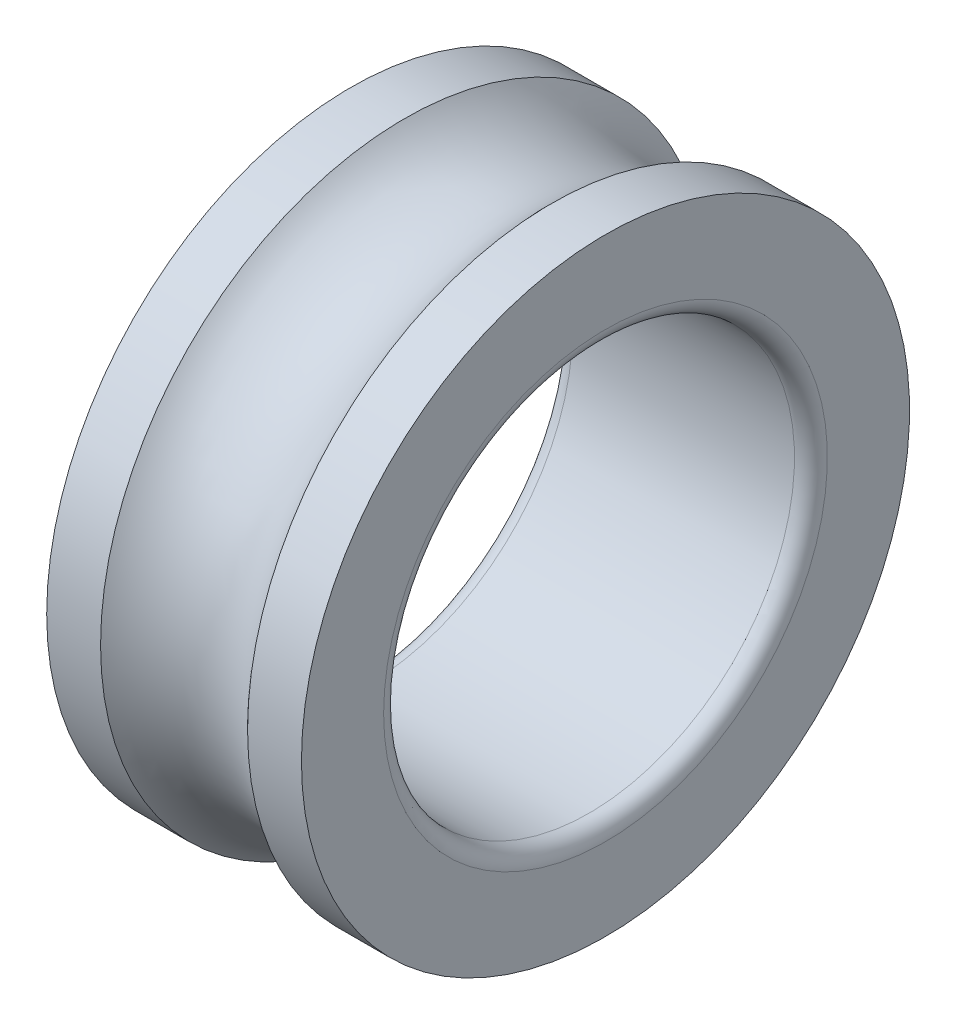
ISO-10303-21;
HEADER;
FILE_DESCRIPTION(('STEP AP214'),'2;1');
FILE_NAME('part.step','',(''),(''),'','','');
FILE_SCHEMA(('AUTOMOTIVE_DESIGN { 1 0 10303 214 1 1 1 1 }'));
ENDSEC;
DATA;
#1=APPLICATION_CONTEXT('core data for automotive mechanical design processes');
#2=APPLICATION_PROTOCOL_DEFINITION('international standard','automotive_design',2000,#1);
#3=PRODUCT_CONTEXT('',#1,'mechanical');
#4=PRODUCT('Part','Part','',(#3));
#5=PRODUCT_RELATED_PRODUCT_CATEGORY('part','',(#4));
#6=PRODUCT_DEFINITION_FORMATION('','',#4);
#7=PRODUCT_DEFINITION_CONTEXT('part definition',#1,'design');
#8=PRODUCT_DEFINITION('design','',#6,#7);
#9=PRODUCT_DEFINITION_SHAPE('','',#8);
#10=(LENGTH_UNIT() NAMED_UNIT(*) SI_UNIT(.MILLI.,.METRE.));
#11=(NAMED_UNIT(*) PLANE_ANGLE_UNIT() SI_UNIT($,.RADIAN.));
#12=(NAMED_UNIT(*) SI_UNIT($,.STERADIAN.) SOLID_ANGLE_UNIT());
#13=UNCERTAINTY_MEASURE_WITH_UNIT(LENGTH_MEASURE(1.E-05),#10,'distance_accuracy_value','');
#14=(GEOMETRIC_REPRESENTATION_CONTEXT(3) GLOBAL_UNCERTAINTY_ASSIGNED_CONTEXT((#13)) GLOBAL_UNIT_ASSIGNED_CONTEXT((#10,
#11,#12)) REPRESENTATION_CONTEXT('',''));
#15=CARTESIAN_POINT('',(0.,0.,0.));
#16=DIRECTION('',(0.,0.,1.));
#17=DIRECTION('',(1.,0.,0.));
#18=AXIS2_PLACEMENT_3D('',#15,#16,#17);
#19=CARTESIAN_POINT('',(2.62307692307692,6.26153846153845,0.));
#20=DIRECTION('',(-1.,0.,0.));
#21=DIRECTION('',(0.,0.,1.));
#22=AXIS2_PLACEMENT_3D('',#19,#20,#21);
#23=PLANE('',#22);
#24=CARTESIAN_POINT('',(2.62307692307692,0.,0.));
#25=DIRECTION('',(-1.,0.,0.));
#26=DIRECTION('',(0.,0.,1.));
#27=AXIS2_PLACEMENT_3D('',#24,#25,#26);
#28=CIRCLE('',#27,4.56923076923076);
#29=CARTESIAN_POINT('',(2.62307692307692,0.,4.56923076923076));
#30=VERTEX_POINT('',#29);
#31=EDGE_CURVE('E10',#30,#30,#28,.T.);
#32=ORIENTED_EDGE('',*,*,#31,.T.);
#33=EDGE_LOOP('',(#32));
#34=FACE_BOUND('',#33,.T.);
#35=CARTESIAN_POINT('',(2.62307692307692,0.,0.));
#36=DIRECTION('',(-1.,0.,0.));
#37=DIRECTION('',(0.,0.,1.));
#38=AXIS2_PLACEMENT_3D('',#35,#36,#37);
#39=CIRCLE('',#38,6.26153846153845);
#40=CARTESIAN_POINT('',(2.62307692307692,0.,6.26153846153845));
#41=VERTEX_POINT('',#40);
#42=EDGE_CURVE('E53',#41,#41,#39,.T.);
#43=ORIENTED_EDGE('',*,*,#42,.F.);
#44=EDGE_LOOP('',(#43));
#45=FACE_BOUND('',#44,.T.);
#46=ADVANCED_FACE('F33',(#34,#45),#23,.F.);
#47=CARTESIAN_POINT('',(0.,0.,0.));
#48=DIRECTION('',(-1.,0.,0.));
#49=DIRECTION('',(0.,0.,1.));
#50=AXIS2_PLACEMENT_3D('',#47,#48,#49);
#51=CYLINDRICAL_SURFACE('',#50,6.26153846153845);
#52=CARTESIAN_POINT('',(1.51364601553832,0.,0.));
#53=DIRECTION('',(-1.,0.,0.));
#54=DIRECTION('',(0.,0.,1.));
#55=AXIS2_PLACEMENT_3D('',#52,#53,#54);
#56=CIRCLE('',#55,6.26153846153845);
#57=CARTESIAN_POINT('',(1.51364601553832,0.,6.26153846153845));
#58=VERTEX_POINT('',#57);
#59=EDGE_CURVE('E56',#58,#58,#56,.T.);
#60=ORIENTED_EDGE('',*,*,#59,.F.);
#61=EDGE_LOOP('',(#60));
#62=FACE_BOUND('',#61,.T.);
#63=ORIENTED_EDGE('',*,*,#42,.T.);
#64=EDGE_LOOP('',(#63));
#65=FACE_BOUND('',#64,.T.);
#66=ADVANCED_FACE('F77',(#62,#65),#51,.T.);
#67=CARTESIAN_POINT('',(0.,0.,0.));
#68=DIRECTION('',(-1.,0.,0.));
#69=DIRECTION('',(0.,0.,1.));
#70=AXIS2_PLACEMENT_3D('',#67,#68,#69);
#71=TOROIDAL_SURFACE('',#70,7.6153846153846,2.03076923076923);
#72=CARTESIAN_POINT('',(-1.51364601553832,0.,0.));
#73=DIRECTION('',(-1.,0.,0.));
#74=DIRECTION('',(0.,0.,1.));
#75=AXIS2_PLACEMENT_3D('',#72,#73,#74);
#76=CIRCLE('',#75,6.26153846153845);
#77=CARTESIAN_POINT('',(-1.51364601553832,0.,6.26153846153845));
#78=VERTEX_POINT('',#77);
#79=EDGE_CURVE('E59',#78,#78,#76,.T.);
#80=ORIENTED_EDGE('',*,*,#79,.F.);
#81=EDGE_LOOP('',(#80));
#82=FACE_BOUND('',#81,.T.);
#83=ORIENTED_EDGE('',*,*,#59,.T.);
#84=EDGE_LOOP('',(#83));
#85=FACE_BOUND('',#84,.T.);
#86=ADVANCED_FACE('F71',(#82,#85),#71,.F.);
#87=CARTESIAN_POINT('',(0.,0.,0.));
#88=DIRECTION('',(-1.,0.,0.));
#89=DIRECTION('',(0.,0.,1.));
#90=AXIS2_PLACEMENT_3D('',#87,#88,#89);
#91=CYLINDRICAL_SURFACE('',#90,6.26153846153845);
#92=CARTESIAN_POINT('',(-2.62307692307692,0.,0.));
#93=DIRECTION('',(-1.,0.,0.));
#94=DIRECTION('',(0.,0.,1.));
#95=AXIS2_PLACEMENT_3D('',#92,#93,#94);
#96=CIRCLE('',#95,6.26153846153845);
#97=CARTESIAN_POINT('',(-2.62307692307692,0.,6.26153846153845));
#98=VERTEX_POINT('',#97);
#99=EDGE_CURVE('E62',#98,#98,#96,.T.);
#100=ORIENTED_EDGE('',*,*,#99,.F.);
#101=EDGE_LOOP('',(#100));
#102=FACE_BOUND('',#101,.T.);
#103=ORIENTED_EDGE('',*,*,#79,.T.);
#104=EDGE_LOOP('',(#103));
#105=FACE_BOUND('',#104,.T.);
#106=ADVANCED_FACE('F68',(#102,#105),#91,.T.);
#107=CARTESIAN_POINT('',(-2.62307692307692,6.26153846153845,0.));
#108=DIRECTION('',(1.,0.,0.));
#109=DIRECTION('',(0.,0.,-1.));
#110=AXIS2_PLACEMENT_3D('',#107,#108,#109);
#111=PLANE('',#110);
#112=CARTESIAN_POINT('',(-2.62307692307692,0.,0.));
#113=DIRECTION('',(1.,0.,0.));
#114=DIRECTION('',(0.,0.,-1.));
#115=AXIS2_PLACEMENT_3D('',#112,#113,#114);
#116=CIRCLE('',#115,4.56923076923076);
#117=CARTESIAN_POINT('',(-2.62307692307692,0.,-4.56923076923076));
#118=VERTEX_POINT('',#117);
#119=EDGE_CURVE('E40',#118,#118,#116,.T.);
#120=ORIENTED_EDGE('',*,*,#119,.T.);
#121=EDGE_LOOP('',(#120));
#122=FACE_BOUND('',#121,.T.);
#123=ORIENTED_EDGE('',*,*,#99,.T.);
#124=EDGE_LOOP('',(#123));
#125=FACE_BOUND('',#124,.T.);
#126=ADVANCED_FACE('F66',(#122,#125),#111,.F.);
#127=CARTESIAN_POINT('',(0.,0.,0.));
#128=DIRECTION('',(-1.,0.,0.));
#129=DIRECTION('',(0.,0.,1.));
#130=AXIS2_PLACEMENT_3D('',#127,#128,#129);
#131=CYLINDRICAL_SURFACE('',#130,4.23076923076922);
#132=CARTESIAN_POINT('',(-2.28461538461538,0.,0.));
#133=DIRECTION('',(1.,0.,0.));
#134=DIRECTION('',(0.,0.,-1.));
#135=AXIS2_PLACEMENT_3D('',#132,#133,#134);
#136=CIRCLE('',#135,4.23076923076922);
#137=CARTESIAN_POINT('',(-2.28461538461538,0.,-4.23076923076922));
#138=VERTEX_POINT('',#137);
#139=EDGE_CURVE('E44',#138,#138,#136,.F.);
#140=ORIENTED_EDGE('',*,*,#139,.T.);
#141=EDGE_LOOP('',(#140));
#142=FACE_BOUND('',#141,.T.);
#143=CARTESIAN_POINT('',(2.28461538461538,0.,0.));
#144=DIRECTION('',(-1.,0.,0.));
#145=DIRECTION('',(0.,0.,1.));
#146=AXIS2_PLACEMENT_3D('',#143,#144,#145);
#147=CIRCLE('',#146,4.23076923076922);
#148=CARTESIAN_POINT('',(2.28461538461538,0.,4.23076923076922));
#149=VERTEX_POINT('',#148);
#150=EDGE_CURVE('E48',#149,#149,#147,.F.);
#151=ORIENTED_EDGE('',*,*,#150,.T.);
#152=EDGE_LOOP('',(#151));
#153=FACE_BOUND('',#152,.T.);
#154=ADVANCED_FACE('F92',(#142,#153),#131,.F.);
#155=CARTESIAN_POINT('',(-2.28461538461538,0.,0.));
#156=DIRECTION('',(1.,0.,0.));
#157=DIRECTION('',(0.,0.,-1.));
#158=AXIS2_PLACEMENT_3D('',#155,#156,#157);
#159=TOROIDAL_SURFACE('',#158,4.56923076923076,0.338461538461538);
#160=ORIENTED_EDGE('',*,*,#119,.F.);
#161=EDGE_LOOP('',(#160));
#162=FACE_BOUND('',#161,.T.);
#163=ORIENTED_EDGE('',*,*,#139,.F.);
#164=EDGE_LOOP('',(#163));
#165=FACE_BOUND('',#164,.T.);
#166=ADVANCED_FACE('F90',(#162,#165),#159,.T.);
#167=CARTESIAN_POINT('',(2.28461538461538,0.,0.));
#168=DIRECTION('',(-1.,0.,0.));
#169=DIRECTION('',(0.,0.,1.));
#170=AXIS2_PLACEMENT_3D('',#167,#168,#169);
#171=TOROIDAL_SURFACE('',#170,4.56923076923076,0.338461538461538);
#172=ORIENTED_EDGE('',*,*,#150,.F.);
#173=EDGE_LOOP('',(#172));
#174=FACE_BOUND('',#173,.T.);
#175=ORIENTED_EDGE('',*,*,#31,.F.);
#176=EDGE_LOOP('',(#175));
#177=FACE_BOUND('',#176,.T.);
#178=ADVANCED_FACE('F35',(#174,#177),#171,.T.);
#179=CLOSED_SHELL('',(#46,#66,#86,#106,#126,#154,#166,#178));
#180=MANIFOLD_SOLID_BREP('B2',#179);
#181=ADVANCED_BREP_SHAPE_REPRESENTATION('',(#18,#180),#14);
#182=SHAPE_DEFINITION_REPRESENTATION(#9,#181);
ENDSEC;
END-ISO-10303-21;
